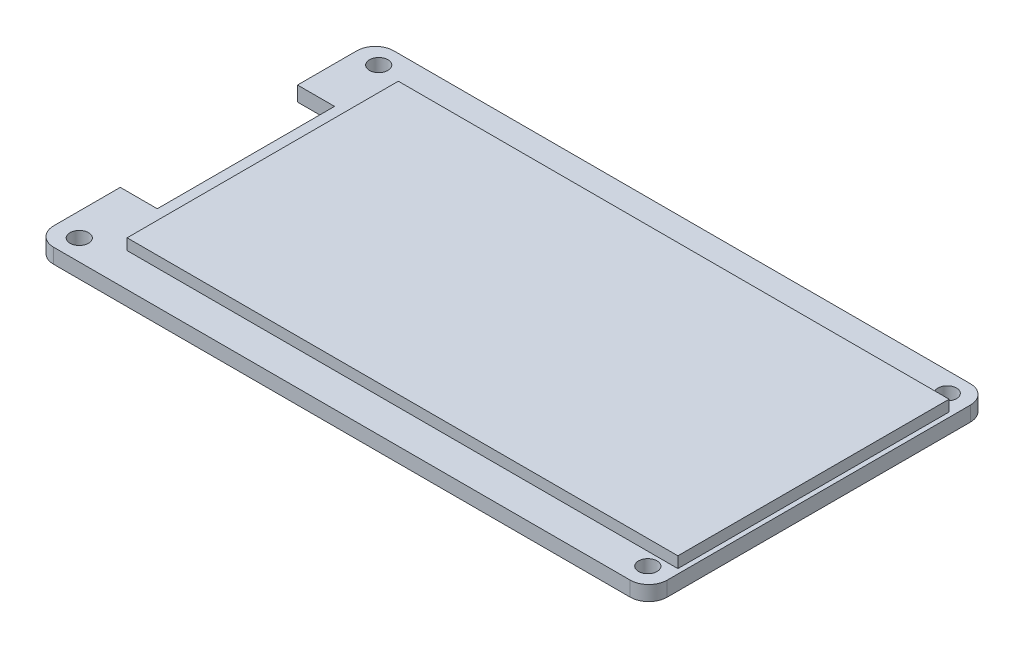
ISO-10303-21;
HEADER;
FILE_DESCRIPTION(('STEP AP214'),'2;1');
FILE_NAME('part.step','',(''),(''),'','','');
FILE_SCHEMA(('AUTOMOTIVE_DESIGN { 1 0 10303 214 1 1 1 1 }'));
ENDSEC;
DATA;
#1=APPLICATION_CONTEXT('core data for automotive mechanical design processes');
#2=APPLICATION_PROTOCOL_DEFINITION('international standard','automotive_design',2000,#1);
#3=PRODUCT_CONTEXT('',#1,'mechanical');
#4=PRODUCT('Part','Part','',(#3));
#5=PRODUCT_RELATED_PRODUCT_CATEGORY('part','',(#4));
#6=PRODUCT_DEFINITION_FORMATION('','',#4);
#7=PRODUCT_DEFINITION_CONTEXT('part definition',#1,'design');
#8=PRODUCT_DEFINITION('design','',#6,#7);
#9=PRODUCT_DEFINITION_SHAPE('','',#8);
#10=(LENGTH_UNIT() NAMED_UNIT(*) SI_UNIT(.MILLI.,.METRE.));
#11=(NAMED_UNIT(*) PLANE_ANGLE_UNIT() SI_UNIT($,.RADIAN.));
#12=(NAMED_UNIT(*) SI_UNIT($,.STERADIAN.) SOLID_ANGLE_UNIT());
#13=UNCERTAINTY_MEASURE_WITH_UNIT(LENGTH_MEASURE(1.E-05),#10,'distance_accuracy_value','');
#14=(GEOMETRIC_REPRESENTATION_CONTEXT(3) GLOBAL_UNCERTAINTY_ASSIGNED_CONTEXT((#13)) GLOBAL_UNIT_ASSIGNED_CONTEXT((#10,
#11,#12)) REPRESENTATION_CONTEXT('',''));
#15=CARTESIAN_POINT('',(0.,0.,0.));
#16=DIRECTION('',(0.,0.,1.));
#17=DIRECTION('',(1.,0.,0.));
#18=AXIS2_PLACEMENT_3D('',#15,#16,#17);
#19=CARTESIAN_POINT('',(-31.145,1.6,16.375));
#20=DIRECTION('',(0.,1.,0.));
#21=DIRECTION('',(0.,0.,1.));
#22=AXIS2_PLACEMENT_3D('',#19,#20,#21);
#23=PLANE('',#22);
#24=CARTESIAN_POINT('',(30.795,1.6,-16.225));
#25=DIRECTION('',(0.,1.,0.));
#26=DIRECTION('',(0.,0.,1.));
#27=AXIS2_PLACEMENT_3D('',#24,#25,#26);
#28=CIRCLE('',#27,0.999999999999998);
#29=CARTESIAN_POINT('',(30.795,1.6,-15.225));
#30=VERTEX_POINT('',#29);
#31=EDGE_CURVE('E316',#30,#30,#28,.T.);
#32=ORIENTED_EDGE('',*,*,#31,.F.);
#33=EDGE_LOOP('',(#32));
#34=FACE_BOUND('',#33,.T.);
#35=CARTESIAN_POINT('',(-30.625,1.6,16.125));
#36=DIRECTION('',(0.,1.,0.));
#37=DIRECTION('',(0.,0.,1.));
#38=AXIS2_PLACEMENT_3D('',#35,#36,#37);
#39=CIRCLE('',#38,1.);
#40=CARTESIAN_POINT('',(-30.625,1.6,17.125));
#41=VERTEX_POINT('',#40);
#42=EDGE_CURVE('E182',#41,#41,#39,.T.);
#43=ORIENTED_EDGE('',*,*,#42,.F.);
#44=EDGE_LOOP('',(#43));
#45=FACE_BOUND('',#44,.T.);
#46=DIRECTION('',(1.,0.,0.));
#47=VECTOR('',#46,1.);
#48=CARTESIAN_POINT('',(-33.145,1.6,-9.975));
#49=LINE('',#48,#47);
#50=CARTESIAN_POINT('',(-33.145,1.6,-9.975));
#51=VERTEX_POINT('',#50);
#52=CARTESIAN_POINT('',(-29.145,1.6,-9.975));
#53=VERTEX_POINT('',#52);
#54=EDGE_CURVE('E213',#51,#53,#49,.T.);
#55=ORIENTED_EDGE('',*,*,#54,.T.);
#56=DIRECTION('',(0.,0.,1.));
#57=VECTOR('',#56,1.);
#58=CARTESIAN_POINT('',(-29.145,1.6,-9.975));
#59=LINE('',#58,#57);
#60=CARTESIAN_POINT('',(-29.145,1.6,9.175));
#61=VERTEX_POINT('',#60);
#62=EDGE_CURVE('E117',#53,#61,#59,.T.);
#63=ORIENTED_EDGE('',*,*,#62,.T.);
#64=DIRECTION('',(-1.,0.,0.));
#65=VECTOR('',#64,1.);
#66=CARTESIAN_POINT('',(-33.145,1.6,9.175));
#67=LINE('',#66,#65);
#68=CARTESIAN_POINT('',(-33.145,1.6,9.175));
#69=VERTEX_POINT('',#68);
#70=EDGE_CURVE('E250',#61,#69,#67,.T.);
#71=ORIENTED_EDGE('',*,*,#70,.T.);
#72=DIRECTION('',(0.,0.,1.));
#73=VECTOR('',#72,1.);
#74=CARTESIAN_POINT('',(-33.145,1.6,9.175));
#75=LINE('',#74,#73);
#76=CARTESIAN_POINT('',(-33.145,1.6,16.375));
#77=VERTEX_POINT('',#76);
#78=EDGE_CURVE('E270',#69,#77,#75,.T.);
#79=ORIENTED_EDGE('',*,*,#78,.T.);
#80=CARTESIAN_POINT('',(-31.145,1.6,16.375));
#81=DIRECTION('',(0.,1.,0.));
#82=DIRECTION('',(0.,0.,1.));
#83=AXIS2_PLACEMENT_3D('',#80,#81,#82);
#84=CIRCLE('',#83,2.);
#85=CARTESIAN_POINT('',(-31.145,1.6,18.375));
#86=VERTEX_POINT('',#85);
#87=EDGE_CURVE('E266',#77,#86,#84,.T.);
#88=ORIENTED_EDGE('',*,*,#87,.T.);
#89=DIRECTION('',(1.,0.,0.));
#90=VECTOR('',#89,1.);
#91=CARTESIAN_POINT('',(-31.145,1.6,18.375));
#92=LINE('',#91,#90);
#93=CARTESIAN_POINT('',(31.145,1.6,18.375));
#94=VERTEX_POINT('',#93);
#95=EDGE_CURVE('E269',#86,#94,#92,.T.);
#96=ORIENTED_EDGE('',*,*,#95,.T.);
#97=CARTESIAN_POINT('',(31.145,1.6,16.375));
#98=DIRECTION('',(0.,1.,0.));
#99=DIRECTION('',(0.,0.,-1.));
#100=AXIS2_PLACEMENT_3D('',#97,#98,#99);
#101=CIRCLE('',#100,2.);
#102=CARTESIAN_POINT('',(33.145,1.6,16.375));
#103=VERTEX_POINT('',#102);
#104=EDGE_CURVE('E274',#94,#103,#101,.T.);
#105=ORIENTED_EDGE('',*,*,#104,.T.);
#106=DIRECTION('',(0.,0.,-1.));
#107=VECTOR('',#106,1.);
#108=CARTESIAN_POINT('',(33.145,1.6,-16.375));
#109=LINE('',#108,#107);
#110=CARTESIAN_POINT('',(33.145,1.6,-16.375));
#111=VERTEX_POINT('',#110);
#112=EDGE_CURVE('E281',#103,#111,#109,.T.);
#113=ORIENTED_EDGE('',*,*,#112,.T.);
#114=CARTESIAN_POINT('',(31.145,1.6,-16.375));
#115=DIRECTION('',(0.,1.,0.));
#116=DIRECTION('',(0.,0.,1.));
#117=AXIS2_PLACEMENT_3D('',#114,#115,#116);
#118=CIRCLE('',#117,2.);
#119=CARTESIAN_POINT('',(31.145,1.6,-18.375));
#120=VERTEX_POINT('',#119);
#121=EDGE_CURVE('E152',#111,#120,#118,.T.);
#122=ORIENTED_EDGE('',*,*,#121,.T.);
#123=DIRECTION('',(-1.,0.,0.));
#124=VECTOR('',#123,1.);
#125=CARTESIAN_POINT('',(-31.145,1.6,-18.375));
#126=LINE('',#125,#124);
#127=CARTESIAN_POINT('',(-31.145,1.6,-18.375));
#128=VERTEX_POINT('',#127);
#129=EDGE_CURVE('E145',#120,#128,#126,.T.);
#130=ORIENTED_EDGE('',*,*,#129,.T.);
#131=CARTESIAN_POINT('',(-31.145,1.6,-16.375));
#132=DIRECTION('',(0.,1.,0.));
#133=DIRECTION('',(0.,0.,1.));
#134=AXIS2_PLACEMENT_3D('',#131,#132,#133);
#135=CIRCLE('',#134,2.);
#136=CARTESIAN_POINT('',(-33.145,1.6,-16.375));
#137=VERTEX_POINT('',#136);
#138=EDGE_CURVE('E149',#128,#137,#135,.T.);
#139=ORIENTED_EDGE('',*,*,#138,.T.);
#140=DIRECTION('',(0.,0.,1.));
#141=VECTOR('',#140,1.);
#142=CARTESIAN_POINT('',(-33.145,1.6,-16.375));
#143=LINE('',#142,#141);
#144=EDGE_CURVE('E64',#137,#51,#143,.T.);
#145=ORIENTED_EDGE('',*,*,#144,.T.);
#146=EDGE_LOOP('',(#55,#63,#71,#79,#88,#96,#105,#113,#122,#130,#139,#145));
#147=FACE_BOUND('',#146,.T.);
#148=CARTESIAN_POINT('',(30.795,1.6,16.125));
#149=DIRECTION('',(0.,1.,0.));
#150=DIRECTION('',(0.,0.,1.));
#151=AXIS2_PLACEMENT_3D('',#148,#149,#150);
#152=CIRCLE('',#151,0.999999999999998);
#153=CARTESIAN_POINT('',(30.795,1.6,17.125));
#154=VERTEX_POINT('',#153);
#155=EDGE_CURVE('E308',#154,#154,#152,.T.);
#156=ORIENTED_EDGE('',*,*,#155,.F.);
#157=EDGE_LOOP('',(#156));
#158=FACE_BOUND('',#157,.T.);
#159=CARTESIAN_POINT('',(-30.625,1.6,-16.225));
#160=DIRECTION('',(0.,1.,0.));
#161=DIRECTION('',(0.,0.,1.));
#162=AXIS2_PLACEMENT_3D('',#159,#160,#161);
#163=CIRCLE('',#162,1.);
#164=CARTESIAN_POINT('',(-30.625,1.6,-15.225));
#165=VERTEX_POINT('',#164);
#166=EDGE_CURVE('E324',#165,#165,#163,.T.);
#167=ORIENTED_EDGE('',*,*,#166,.F.);
#168=EDGE_LOOP('',(#167));
#169=FACE_BOUND('',#168,.T.);
#170=DIRECTION('',(1.,0.,0.));
#171=VECTOR('',#170,1.);
#172=CARTESIAN_POINT('',(-26.855,1.6,14.725));
#173=LINE('',#172,#171);
#174=CARTESIAN_POINT('',(-26.855,1.6,14.725));
#175=VERTEX_POINT('',#174);
#176=CARTESIAN_POINT('',(32.645,1.6,14.725));
#177=VERTEX_POINT('',#176);
#178=EDGE_CURVE('E357',#175,#177,#173,.T.);
#179=ORIENTED_EDGE('',*,*,#178,.F.);
#180=DIRECTION('',(0.,0.,1.));
#181=VECTOR('',#180,1.);
#182=CARTESIAN_POINT('',(-26.855,1.6,-14.575));
#183=LINE('',#182,#181);
#184=CARTESIAN_POINT('',(-26.855,1.6,-14.575));
#185=VERTEX_POINT('',#184);
#186=EDGE_CURVE('E361',#185,#175,#183,.T.);
#187=ORIENTED_EDGE('',*,*,#186,.F.);
#188=DIRECTION('',(-1.,0.,0.));
#189=VECTOR('',#188,1.);
#190=CARTESIAN_POINT('',(-26.855,1.6,-14.575));
#191=LINE('',#190,#189);
#192=CARTESIAN_POINT('',(32.645,1.6,-14.575));
#193=VERTEX_POINT('',#192);
#194=EDGE_CURVE('E350',#193,#185,#191,.T.);
#195=ORIENTED_EDGE('',*,*,#194,.F.);
#196=DIRECTION('',(0.,0.,-1.));
#197=VECTOR('',#196,1.);
#198=CARTESIAN_POINT('',(32.645,1.6,-14.575));
#199=LINE('',#198,#197);
#200=EDGE_CURVE('E354',#177,#193,#199,.T.);
#201=ORIENTED_EDGE('',*,*,#200,.F.);
#202=EDGE_LOOP('',(#179,#187,#195,#201));
#203=FACE_BOUND('',#202,.T.);
#204=ADVANCED_FACE('F39',(#34,#45,#147,#158,#169,#203),#23,.T.);
#205=CARTESIAN_POINT('',(-31.145,0.,16.375));
#206=DIRECTION('',(0.,1.,0.));
#207=DIRECTION('',(0.,0.,1.));
#208=AXIS2_PLACEMENT_3D('',#205,#206,#207);
#209=PLANE('',#208);
#210=DIRECTION('',(1.,0.,0.));
#211=VECTOR('',#210,1.);
#212=CARTESIAN_POINT('',(-33.145,0.,-9.975));
#213=LINE('',#212,#211);
#214=CARTESIAN_POINT('',(-33.145,0.,-9.975));
#215=VERTEX_POINT('',#214);
#216=CARTESIAN_POINT('',(-29.145,0.,-9.975));
#217=VERTEX_POINT('',#216);
#218=EDGE_CURVE('E177',#215,#217,#213,.T.);
#219=ORIENTED_EDGE('',*,*,#218,.F.);
#220=DIRECTION('',(0.,0.,1.));
#221=VECTOR('',#220,1.);
#222=CARTESIAN_POINT('',(-33.145,0.,-16.375));
#223=LINE('',#222,#221);
#224=CARTESIAN_POINT('',(-33.145,0.,-16.375));
#225=VERTEX_POINT('',#224);
#226=EDGE_CURVE('E109',#225,#215,#223,.T.);
#227=ORIENTED_EDGE('',*,*,#226,.F.);
#228=CARTESIAN_POINT('',(-31.145,0.,-16.375));
#229=DIRECTION('',(0.,1.,0.));
#230=DIRECTION('',(0.,0.,1.));
#231=AXIS2_PLACEMENT_3D('',#228,#229,#230);
#232=CIRCLE('',#231,2.);
#233=CARTESIAN_POINT('',(-31.145,0.,-18.375));
#234=VERTEX_POINT('',#233);
#235=EDGE_CURVE('E208',#234,#225,#232,.T.);
#236=ORIENTED_EDGE('',*,*,#235,.F.);
#237=DIRECTION('',(-1.,0.,0.));
#238=VECTOR('',#237,1.);
#239=CARTESIAN_POINT('',(-31.145,0.,-18.375));
#240=LINE('',#239,#238);
#241=CARTESIAN_POINT('',(31.145,0.,-18.375));
#242=VERTEX_POINT('',#241);
#243=EDGE_CURVE('E162',#242,#234,#240,.T.);
#244=ORIENTED_EDGE('',*,*,#243,.F.);
#245=CARTESIAN_POINT('',(31.145,0.,-16.375));
#246=DIRECTION('',(0.,1.,0.));
#247=DIRECTION('',(0.,0.,1.));
#248=AXIS2_PLACEMENT_3D('',#245,#246,#247);
#249=CIRCLE('',#248,2.);
#250=CARTESIAN_POINT('',(33.145,0.,-16.375));
#251=VERTEX_POINT('',#250);
#252=EDGE_CURVE('E203',#251,#242,#249,.T.);
#253=ORIENTED_EDGE('',*,*,#252,.F.);
#254=DIRECTION('',(0.,0.,-1.));
#255=VECTOR('',#254,1.);
#256=CARTESIAN_POINT('',(33.145,0.,-16.375));
#257=LINE('',#256,#255);
#258=CARTESIAN_POINT('',(33.145,0.,16.375));
#259=VERTEX_POINT('',#258);
#260=EDGE_CURVE('E200',#259,#251,#257,.T.);
#261=ORIENTED_EDGE('',*,*,#260,.F.);
#262=CARTESIAN_POINT('',(31.145,0.,16.375));
#263=DIRECTION('',(0.,1.,0.));
#264=DIRECTION('',(0.,0.,-1.));
#265=AXIS2_PLACEMENT_3D('',#262,#263,#264);
#266=CIRCLE('',#265,2.);
#267=CARTESIAN_POINT('',(31.145,0.,18.375));
#268=VERTEX_POINT('',#267);
#269=EDGE_CURVE('E197',#268,#259,#266,.T.);
#270=ORIENTED_EDGE('',*,*,#269,.F.);
#271=DIRECTION('',(1.,0.,0.));
#272=VECTOR('',#271,1.);
#273=CARTESIAN_POINT('',(-31.145,0.,18.375));
#274=LINE('',#273,#272);
#275=CARTESIAN_POINT('',(-31.145,0.,18.375));
#276=VERTEX_POINT('',#275);
#277=EDGE_CURVE('E194',#276,#268,#274,.T.);
#278=ORIENTED_EDGE('',*,*,#277,.F.);
#279=CARTESIAN_POINT('',(-31.145,0.,16.375));
#280=DIRECTION('',(0.,1.,0.));
#281=DIRECTION('',(0.,0.,1.));
#282=AXIS2_PLACEMENT_3D('',#279,#280,#281);
#283=CIRCLE('',#282,2.);
#284=CARTESIAN_POINT('',(-33.145,0.,16.375));
#285=VERTEX_POINT('',#284);
#286=EDGE_CURVE('E191',#285,#276,#283,.T.);
#287=ORIENTED_EDGE('',*,*,#286,.F.);
#288=DIRECTION('',(0.,0.,1.));
#289=VECTOR('',#288,1.);
#290=CARTESIAN_POINT('',(-33.145,0.,9.175));
#291=LINE('',#290,#289);
#292=CARTESIAN_POINT('',(-33.145,0.,9.175));
#293=VERTEX_POINT('',#292);
#294=EDGE_CURVE('E188',#293,#285,#291,.T.);
#295=ORIENTED_EDGE('',*,*,#294,.F.);
#296=DIRECTION('',(-1.,0.,0.));
#297=VECTOR('',#296,1.);
#298=CARTESIAN_POINT('',(-33.145,0.,9.175));
#299=LINE('',#298,#297);
#300=CARTESIAN_POINT('',(-29.145,0.,9.175));
#301=VERTEX_POINT('',#300);
#302=EDGE_CURVE('E185',#301,#293,#299,.T.);
#303=ORIENTED_EDGE('',*,*,#302,.F.);
#304=DIRECTION('',(0.,0.,1.));
#305=VECTOR('',#304,1.);
#306=CARTESIAN_POINT('',(-29.145,0.,-9.975));
#307=LINE('',#306,#305);
#308=EDGE_CURVE('E181',#217,#301,#307,.T.);
#309=ORIENTED_EDGE('',*,*,#308,.F.);
#310=EDGE_LOOP('',(#219,#227,#236,#244,#253,#261,#270,#278,#287,#295,#303,#309));
#311=FACE_BOUND('',#310,.T.);
#312=CARTESIAN_POINT('',(-30.625,0.,16.125));
#313=DIRECTION('',(0.,1.,0.));
#314=DIRECTION('',(0.,0.,1.));
#315=AXIS2_PLACEMENT_3D('',#312,#313,#314);
#316=CIRCLE('',#315,1.);
#317=CARTESIAN_POINT('',(-30.625,0.,17.125));
#318=VERTEX_POINT('',#317);
#319=EDGE_CURVE('E303',#318,#318,#316,.T.);
#320=ORIENTED_EDGE('',*,*,#319,.T.);
#321=EDGE_LOOP('',(#320));
#322=FACE_BOUND('',#321,.T.);
#323=CARTESIAN_POINT('',(30.795,0.,16.125));
#324=DIRECTION('',(0.,1.,0.));
#325=DIRECTION('',(0.,0.,1.));
#326=AXIS2_PLACEMENT_3D('',#323,#324,#325);
#327=CIRCLE('',#326,0.999999999999998);
#328=CARTESIAN_POINT('',(30.795,0.,17.125));
#329=VERTEX_POINT('',#328);
#330=EDGE_CURVE('E312',#329,#329,#327,.T.);
#331=ORIENTED_EDGE('',*,*,#330,.T.);
#332=EDGE_LOOP('',(#331));
#333=FACE_BOUND('',#332,.T.);
#334=CARTESIAN_POINT('',(30.795,0.,-16.225));
#335=DIRECTION('',(0.,1.,0.));
#336=DIRECTION('',(0.,0.,1.));
#337=AXIS2_PLACEMENT_3D('',#334,#335,#336);
#338=CIRCLE('',#337,0.999999999999998);
#339=CARTESIAN_POINT('',(30.795,0.,-15.225));
#340=VERTEX_POINT('',#339);
#341=EDGE_CURVE('E320',#340,#340,#338,.T.);
#342=ORIENTED_EDGE('',*,*,#341,.T.);
#343=EDGE_LOOP('',(#342));
#344=FACE_BOUND('',#343,.T.);
#345=CARTESIAN_POINT('',(-30.625,0.,-16.225));
#346=DIRECTION('',(0.,1.,0.));
#347=DIRECTION('',(0.,0.,1.));
#348=AXIS2_PLACEMENT_3D('',#345,#346,#347);
#349=CIRCLE('',#348,1.);
#350=CARTESIAN_POINT('',(-30.625,0.,-15.225));
#351=VERTEX_POINT('',#350);
#352=EDGE_CURVE('E328',#351,#351,#349,.T.);
#353=ORIENTED_EDGE('',*,*,#352,.T.);
#354=EDGE_LOOP('',(#353));
#355=FACE_BOUND('',#354,.T.);
#356=ADVANCED_FACE('F254',(#311,#322,#333,#344,#355),#209,.F.);
#357=CARTESIAN_POINT('',(-33.145,1.6,-9.975));
#358=DIRECTION('',(0.,0.,-1.));
#359=DIRECTION('',(-1.,0.,0.));
#360=AXIS2_PLACEMENT_3D('',#357,#358,#359);
#361=PLANE('',#360);
#362=ORIENTED_EDGE('',*,*,#218,.T.);
#363=DIRECTION('',(0.,-1.,0.));
#364=VECTOR('',#363,1.);
#365=CARTESIAN_POINT('',(-29.145,1.6,-9.975));
#366=LINE('',#365,#364);
#367=EDGE_CURVE('E11',#53,#217,#366,.T.);
#368=ORIENTED_EDGE('',*,*,#367,.F.);
#369=ORIENTED_EDGE('',*,*,#54,.F.);
#370=DIRECTION('',(0.,-1.,0.));
#371=VECTOR('',#370,1.);
#372=CARTESIAN_POINT('',(-33.145,1.6,-9.975));
#373=LINE('',#372,#371);
#374=EDGE_CURVE('E173',#51,#215,#373,.T.);
#375=ORIENTED_EDGE('',*,*,#374,.T.);
#376=EDGE_LOOP('',(#362,#368,#369,#375));
#377=FACE_BOUND('',#376,.T.);
#378=ADVANCED_FACE('F41',(#377),#361,.F.);
#379=CARTESIAN_POINT('',(-29.145,1.6,-9.975));
#380=DIRECTION('',(1.,0.,0.));
#381=DIRECTION('',(0.,0.,-1.));
#382=AXIS2_PLACEMENT_3D('',#379,#380,#381);
#383=PLANE('',#382);
#384=ORIENTED_EDGE('',*,*,#308,.T.);
#385=DIRECTION('',(0.,-1.,0.));
#386=VECTOR('',#385,1.);
#387=CARTESIAN_POINT('',(-29.145,1.6,9.175));
#388=LINE('',#387,#386);
#389=EDGE_CURVE('E48',#61,#301,#388,.T.);
#390=ORIENTED_EDGE('',*,*,#389,.F.);
#391=ORIENTED_EDGE('',*,*,#62,.F.);
#392=ORIENTED_EDGE('',*,*,#367,.T.);
#393=EDGE_LOOP('',(#384,#390,#391,#392));
#394=FACE_BOUND('',#393,.T.);
#395=ADVANCED_FACE('F444',(#394),#383,.F.);
#396=CARTESIAN_POINT('',(-33.145,1.6,9.175));
#397=DIRECTION('',(0.,0.,1.));
#398=DIRECTION('',(1.,0.,0.));
#399=AXIS2_PLACEMENT_3D('',#396,#397,#398);
#400=PLANE('',#399);
#401=ORIENTED_EDGE('',*,*,#302,.T.);
#402=DIRECTION('',(0.,-1.,0.));
#403=VECTOR('',#402,1.);
#404=CARTESIAN_POINT('',(-33.145,1.6,9.175));
#405=LINE('',#404,#403);
#406=EDGE_CURVE('E240',#69,#293,#405,.T.);
#407=ORIENTED_EDGE('',*,*,#406,.F.);
#408=ORIENTED_EDGE('',*,*,#70,.F.);
#409=ORIENTED_EDGE('',*,*,#389,.T.);
#410=EDGE_LOOP('',(#401,#407,#408,#409));
#411=FACE_BOUND('',#410,.T.);
#412=ADVANCED_FACE('F248',(#411),#400,.F.);
#413=CARTESIAN_POINT('',(-33.145,1.6,9.175));
#414=DIRECTION('',(1.,0.,0.));
#415=DIRECTION('',(0.,0.,-1.));
#416=AXIS2_PLACEMENT_3D('',#413,#414,#415);
#417=PLANE('',#416);
#418=ORIENTED_EDGE('',*,*,#294,.T.);
#419=DIRECTION('',(0.,-1.,0.));
#420=VECTOR('',#419,1.);
#421=CARTESIAN_POINT('',(-33.145,1.6,16.375));
#422=LINE('',#421,#420);
#423=EDGE_CURVE('E236',#77,#285,#422,.T.);
#424=ORIENTED_EDGE('',*,*,#423,.F.);
#425=ORIENTED_EDGE('',*,*,#78,.F.);
#426=ORIENTED_EDGE('',*,*,#406,.T.);
#427=EDGE_LOOP('',(#418,#424,#425,#426));
#428=FACE_BOUND('',#427,.T.);
#429=ADVANCED_FACE('F260',(#428),#417,.F.);
#430=CARTESIAN_POINT('',(-31.145,1.6,16.375));
#431=DIRECTION('',(0.,-1.,0.));
#432=DIRECTION('',(0.,0.,-1.));
#433=AXIS2_PLACEMENT_3D('',#430,#431,#432);
#434=CYLINDRICAL_SURFACE('',#433,2.);
#435=ORIENTED_EDGE('',*,*,#286,.T.);
#436=DIRECTION('',(0.,-1.,0.));
#437=VECTOR('',#436,1.);
#438=CARTESIAN_POINT('',(-31.145,1.6,18.375));
#439=LINE('',#438,#437);
#440=EDGE_CURVE('E232',#86,#276,#439,.T.);
#441=ORIENTED_EDGE('',*,*,#440,.F.);
#442=ORIENTED_EDGE('',*,*,#87,.F.);
#443=ORIENTED_EDGE('',*,*,#423,.T.);
#444=EDGE_LOOP('',(#435,#441,#442,#443));
#445=FACE_BOUND('',#444,.T.);
#446=ADVANCED_FACE('F264',(#445),#434,.T.);
#447=CARTESIAN_POINT('',(-31.145,1.6,18.375));
#448=DIRECTION('',(0.,0.,-1.));
#449=DIRECTION('',(-1.,0.,0.));
#450=AXIS2_PLACEMENT_3D('',#447,#448,#449);
#451=PLANE('',#450);
#452=ORIENTED_EDGE('',*,*,#277,.T.);
#453=DIRECTION('',(0.,-1.,0.));
#454=VECTOR('',#453,1.);
#455=CARTESIAN_POINT('',(31.145,1.6,18.375));
#456=LINE('',#455,#454);
#457=EDGE_CURVE('E228',#94,#268,#456,.T.);
#458=ORIENTED_EDGE('',*,*,#457,.F.);
#459=ORIENTED_EDGE('',*,*,#95,.F.);
#460=ORIENTED_EDGE('',*,*,#440,.T.);
#461=EDGE_LOOP('',(#452,#458,#459,#460));
#462=FACE_BOUND('',#461,.T.);
#463=ADVANCED_FACE('F434',(#462),#451,.F.);
#464=CARTESIAN_POINT('',(31.145,1.6,16.375));
#465=DIRECTION('',(0.,-1.,0.));
#466=DIRECTION('',(0.,0.,-1.));
#467=AXIS2_PLACEMENT_3D('',#464,#465,#466);
#468=CYLINDRICAL_SURFACE('',#467,2.);
#469=ORIENTED_EDGE('',*,*,#269,.T.);
#470=DIRECTION('',(0.,-1.,0.));
#471=VECTOR('',#470,1.);
#472=CARTESIAN_POINT('',(33.145,1.6,16.375));
#473=LINE('',#472,#471);
#474=EDGE_CURVE('E224',#103,#259,#473,.T.);
#475=ORIENTED_EDGE('',*,*,#474,.F.);
#476=ORIENTED_EDGE('',*,*,#104,.F.);
#477=ORIENTED_EDGE('',*,*,#457,.T.);
#478=EDGE_LOOP('',(#469,#475,#476,#477));
#479=FACE_BOUND('',#478,.T.);
#480=ADVANCED_FACE('F431',(#479),#468,.T.);
#481=CARTESIAN_POINT('',(33.145,1.6,-16.375));
#482=DIRECTION('',(-1.,0.,0.));
#483=DIRECTION('',(0.,0.,1.));
#484=AXIS2_PLACEMENT_3D('',#481,#482,#483);
#485=PLANE('',#484);
#486=ORIENTED_EDGE('',*,*,#260,.T.);
#487=DIRECTION('',(0.,-1.,0.));
#488=VECTOR('',#487,1.);
#489=CARTESIAN_POINT('',(33.145,1.6,-16.375));
#490=LINE('',#489,#488);
#491=EDGE_CURVE('E220',#111,#251,#490,.T.);
#492=ORIENTED_EDGE('',*,*,#491,.F.);
#493=ORIENTED_EDGE('',*,*,#112,.F.);
#494=ORIENTED_EDGE('',*,*,#474,.T.);
#495=EDGE_LOOP('',(#486,#492,#493,#494));
#496=FACE_BOUND('',#495,.T.);
#497=ADVANCED_FACE('F289',(#496),#485,.F.);
#498=CARTESIAN_POINT('',(31.145,1.6,-16.375));
#499=DIRECTION('',(0.,-1.,0.));
#500=DIRECTION('',(0.,0.,-1.));
#501=AXIS2_PLACEMENT_3D('',#498,#499,#500);
#502=CYLINDRICAL_SURFACE('',#501,2.);
#503=ORIENTED_EDGE('',*,*,#252,.T.);
#504=DIRECTION('',(0.,-1.,0.));
#505=VECTOR('',#504,1.);
#506=CARTESIAN_POINT('',(31.145,1.6,-18.375));
#507=LINE('',#506,#505);
#508=EDGE_CURVE('E166',#120,#242,#507,.T.);
#509=ORIENTED_EDGE('',*,*,#508,.F.);
#510=ORIENTED_EDGE('',*,*,#121,.F.);
#511=ORIENTED_EDGE('',*,*,#491,.T.);
#512=EDGE_LOOP('',(#503,#509,#510,#511));
#513=FACE_BOUND('',#512,.T.);
#514=ADVANCED_FACE('F293',(#513),#502,.T.);
#515=CARTESIAN_POINT('',(-31.145,1.6,-18.375));
#516=DIRECTION('',(0.,0.,1.));
#517=DIRECTION('',(1.,0.,0.));
#518=AXIS2_PLACEMENT_3D('',#515,#516,#517);
#519=PLANE('',#518);
#520=ORIENTED_EDGE('',*,*,#243,.T.);
#521=DIRECTION('',(0.,-1.,0.));
#522=VECTOR('',#521,1.);
#523=CARTESIAN_POINT('',(-31.145,1.6,-18.375));
#524=LINE('',#523,#522);
#525=EDGE_CURVE('E159',#128,#234,#524,.T.);
#526=ORIENTED_EDGE('',*,*,#525,.F.);
#527=ORIENTED_EDGE('',*,*,#129,.F.);
#528=ORIENTED_EDGE('',*,*,#508,.T.);
#529=EDGE_LOOP('',(#520,#526,#527,#528));
#530=FACE_BOUND('',#529,.T.);
#531=ADVANCED_FACE('F160',(#530),#519,.F.);
#532=CARTESIAN_POINT('',(-31.145,1.6,-16.375));
#533=DIRECTION('',(0.,-1.,0.));
#534=DIRECTION('',(0.,0.,-1.));
#535=AXIS2_PLACEMENT_3D('',#532,#533,#534);
#536=CYLINDRICAL_SURFACE('',#535,2.);
#537=ORIENTED_EDGE('',*,*,#235,.T.);
#538=DIRECTION('',(0.,-1.,0.));
#539=VECTOR('',#538,1.);
#540=CARTESIAN_POINT('',(-33.145,1.6,-16.375));
#541=LINE('',#540,#539);
#542=EDGE_CURVE('E167',#137,#225,#541,.T.);
#543=ORIENTED_EDGE('',*,*,#542,.F.);
#544=ORIENTED_EDGE('',*,*,#138,.F.);
#545=ORIENTED_EDGE('',*,*,#525,.T.);
#546=EDGE_LOOP('',(#537,#543,#544,#545));
#547=FACE_BOUND('',#546,.T.);
#548=ADVANCED_FACE('F169',(#547),#536,.T.);
#549=CARTESIAN_POINT('',(-33.145,1.6,-16.375));
#550=DIRECTION('',(1.,0.,0.));
#551=DIRECTION('',(0.,0.,-1.));
#552=AXIS2_PLACEMENT_3D('',#549,#550,#551);
#553=PLANE('',#552);
#554=ORIENTED_EDGE('',*,*,#226,.T.);
#555=ORIENTED_EDGE('',*,*,#374,.F.);
#556=ORIENTED_EDGE('',*,*,#144,.F.);
#557=ORIENTED_EDGE('',*,*,#542,.T.);
#558=EDGE_LOOP('',(#554,#555,#556,#557));
#559=FACE_BOUND('',#558,.T.);
#560=ADVANCED_FACE('F294',(#559),#553,.F.);
#561=CARTESIAN_POINT('',(-30.625,1.6,16.125));
#562=DIRECTION('',(0.,-1.,0.));
#563=DIRECTION('',(0.,0.,-1.));
#564=AXIS2_PLACEMENT_3D('',#561,#562,#563);
#565=CYLINDRICAL_SURFACE('',#564,1.);
#566=ORIENTED_EDGE('',*,*,#42,.T.);
#567=EDGE_LOOP('',(#566));
#568=FACE_BOUND('',#567,.T.);
#569=ORIENTED_EDGE('',*,*,#319,.F.);
#570=EDGE_LOOP('',(#569));
#571=FACE_BOUND('',#570,.T.);
#572=ADVANCED_FACE('F418',(#568,#571),#565,.F.);
#573=CARTESIAN_POINT('',(30.795,1.6,16.125));
#574=DIRECTION('',(0.,-1.,0.));
#575=DIRECTION('',(0.,0.,-1.));
#576=AXIS2_PLACEMENT_3D('',#573,#574,#575);
#577=CYLINDRICAL_SURFACE('',#576,0.999999999999998);
#578=ORIENTED_EDGE('',*,*,#155,.T.);
#579=EDGE_LOOP('',(#578));
#580=FACE_BOUND('',#579,.T.);
#581=ORIENTED_EDGE('',*,*,#330,.F.);
#582=EDGE_LOOP('',(#581));
#583=FACE_BOUND('',#582,.T.);
#584=ADVANCED_FACE('F521',(#580,#583),#577,.F.);
#585=CARTESIAN_POINT('',(30.795,1.6,-16.225));
#586=DIRECTION('',(0.,-1.,0.));
#587=DIRECTION('',(0.,0.,-1.));
#588=AXIS2_PLACEMENT_3D('',#585,#586,#587);
#589=CYLINDRICAL_SURFACE('',#588,0.999999999999998);
#590=ORIENTED_EDGE('',*,*,#31,.T.);
#591=EDGE_LOOP('',(#590));
#592=FACE_BOUND('',#591,.T.);
#593=ORIENTED_EDGE('',*,*,#341,.F.);
#594=EDGE_LOOP('',(#593));
#595=FACE_BOUND('',#594,.T.);
#596=ADVANCED_FACE('F529',(#592,#595),#589,.F.);
#597=CARTESIAN_POINT('',(-30.625,1.6,-16.225));
#598=DIRECTION('',(0.,-1.,0.));
#599=DIRECTION('',(0.,0.,-1.));
#600=AXIS2_PLACEMENT_3D('',#597,#598,#599);
#601=CYLINDRICAL_SURFACE('',#600,1.);
#602=ORIENTED_EDGE('',*,*,#166,.T.);
#603=EDGE_LOOP('',(#602));
#604=FACE_BOUND('',#603,.T.);
#605=ORIENTED_EDGE('',*,*,#352,.F.);
#606=EDGE_LOOP('',(#605));
#607=FACE_BOUND('',#606,.T.);
#608=ADVANCED_FACE('F537',(#604,#607),#601,.F.);
#609=CARTESIAN_POINT('',(-26.855,2.8,-14.575));
#610=DIRECTION('',(1.,0.,0.));
#611=DIRECTION('',(0.,0.,-1.));
#612=AXIS2_PLACEMENT_3D('',#609,#610,#611);
#613=PLANE('',#612);
#614=ORIENTED_EDGE('',*,*,#186,.T.);
#615=DIRECTION('',(0.,-1.,0.));
#616=VECTOR('',#615,1.);
#617=CARTESIAN_POINT('',(-26.855,2.8,14.725));
#618=LINE('',#617,#616);
#619=CARTESIAN_POINT('',(-26.855,2.8,14.725));
#620=VERTEX_POINT('',#619);
#621=EDGE_CURVE('E332',#620,#175,#618,.T.);
#622=ORIENTED_EDGE('',*,*,#621,.F.);
#623=DIRECTION('',(0.,0.,1.));
#624=VECTOR('',#623,1.);
#625=CARTESIAN_POINT('',(-26.855,2.8,-14.575));
#626=LINE('',#625,#624);
#627=CARTESIAN_POINT('',(-26.855,2.8,-14.575));
#628=VERTEX_POINT('',#627);
#629=EDGE_CURVE('E353',#628,#620,#626,.T.);
#630=ORIENTED_EDGE('',*,*,#629,.F.);
#631=DIRECTION('',(0.,-1.,0.));
#632=VECTOR('',#631,1.);
#633=CARTESIAN_POINT('',(-26.855,2.8,-14.575));
#634=LINE('',#633,#632);
#635=EDGE_CURVE('E345',#628,#185,#634,.T.);
#636=ORIENTED_EDGE('',*,*,#635,.T.);
#637=EDGE_LOOP('',(#614,#622,#630,#636));
#638=FACE_BOUND('',#637,.T.);
#639=ADVANCED_FACE('F389',(#638),#613,.F.);
#640=CARTESIAN_POINT('',(-26.855,2.8,14.725));
#641=DIRECTION('',(0.,0.,-1.));
#642=DIRECTION('',(-1.,0.,0.));
#643=AXIS2_PLACEMENT_3D('',#640,#641,#642);
#644=PLANE('',#643);
#645=ORIENTED_EDGE('',*,*,#178,.T.);
#646=DIRECTION('',(0.,-1.,0.));
#647=VECTOR('',#646,1.);
#648=CARTESIAN_POINT('',(32.645,2.8,14.725));
#649=LINE('',#648,#647);
#650=CARTESIAN_POINT('',(32.645,2.8,14.725));
#651=VERTEX_POINT('',#650);
#652=EDGE_CURVE('E339',#651,#177,#649,.T.);
#653=ORIENTED_EDGE('',*,*,#652,.F.);
#654=DIRECTION('',(1.,0.,0.));
#655=VECTOR('',#654,1.);
#656=CARTESIAN_POINT('',(-26.855,2.8,14.725));
#657=LINE('',#656,#655);
#658=EDGE_CURVE('E372',#620,#651,#657,.T.);
#659=ORIENTED_EDGE('',*,*,#658,.F.);
#660=ORIENTED_EDGE('',*,*,#621,.T.);
#661=EDGE_LOOP('',(#645,#653,#659,#660));
#662=FACE_BOUND('',#661,.T.);
#663=ADVANCED_FACE('F394',(#662),#644,.F.);
#664=CARTESIAN_POINT('',(32.645,2.8,-14.575));
#665=DIRECTION('',(-1.,0.,0.));
#666=DIRECTION('',(0.,0.,1.));
#667=AXIS2_PLACEMENT_3D('',#664,#665,#666);
#668=PLANE('',#667);
#669=ORIENTED_EDGE('',*,*,#200,.T.);
#670=DIRECTION('',(0.,-1.,0.));
#671=VECTOR('',#670,1.);
#672=CARTESIAN_POINT('',(32.645,2.8,-14.575));
#673=LINE('',#672,#671);
#674=CARTESIAN_POINT('',(32.645,2.8,-14.575));
#675=VERTEX_POINT('',#674);
#676=EDGE_CURVE('E55',#675,#193,#673,.T.);
#677=ORIENTED_EDGE('',*,*,#676,.F.);
#678=DIRECTION('',(0.,0.,-1.));
#679=VECTOR('',#678,1.);
#680=CARTESIAN_POINT('',(32.645,2.8,-14.575));
#681=LINE('',#680,#679);
#682=EDGE_CURVE('E368',#651,#675,#681,.T.);
#683=ORIENTED_EDGE('',*,*,#682,.F.);
#684=ORIENTED_EDGE('',*,*,#652,.T.);
#685=EDGE_LOOP('',(#669,#677,#683,#684));
#686=FACE_BOUND('',#685,.T.);
#687=ADVANCED_FACE('F403',(#686),#668,.F.);
#688=CARTESIAN_POINT('',(-26.855,2.8,-14.575));
#689=DIRECTION('',(0.,0.,1.));
#690=DIRECTION('',(1.,0.,0.));
#691=AXIS2_PLACEMENT_3D('',#688,#689,#690);
#692=PLANE('',#691);
#693=ORIENTED_EDGE('',*,*,#194,.T.);
#694=ORIENTED_EDGE('',*,*,#635,.F.);
#695=DIRECTION('',(-1.,0.,0.));
#696=VECTOR('',#695,1.);
#697=CARTESIAN_POINT('',(-26.855,2.8,-14.575));
#698=LINE('',#697,#696);
#699=EDGE_CURVE('E349',#675,#628,#698,.T.);
#700=ORIENTED_EDGE('',*,*,#699,.F.);
#701=ORIENTED_EDGE('',*,*,#676,.T.);
#702=EDGE_LOOP('',(#693,#694,#700,#701));
#703=FACE_BOUND('',#702,.T.);
#704=ADVANCED_FACE('F406',(#703),#692,.F.);
#705=CARTESIAN_POINT('',(0.,2.8,0.));
#706=DIRECTION('',(0.,1.,0.));
#707=DIRECTION('',(0.,0.,1.));
#708=AXIS2_PLACEMENT_3D('',#705,#706,#707);
#709=PLANE('',#708);
#710=ORIENTED_EDGE('',*,*,#629,.T.);
#711=ORIENTED_EDGE('',*,*,#658,.T.);
#712=ORIENTED_EDGE('',*,*,#682,.T.);
#713=ORIENTED_EDGE('',*,*,#699,.T.);
#714=EDGE_LOOP('',(#710,#711,#712,#713));
#715=FACE_BOUND('',#714,.T.);
#716=ADVANCED_FACE('F382',(#715),#709,.T.);
#717=CLOSED_SHELL('',(#204,#356,#378,#395,#412,#429,#446,#463,#480,#497,#514,#531,#548,#560,
#572,#584,#596,#608,#639,#663,#687,#704,#716));
#718=MANIFOLD_SOLID_BREP('B2',#717);
#719=ADVANCED_BREP_SHAPE_REPRESENTATION('',(#18,#718),#14);
#720=SHAPE_DEFINITION_REPRESENTATION(#9,#719);
ENDSEC;
END-ISO-10303-21;
